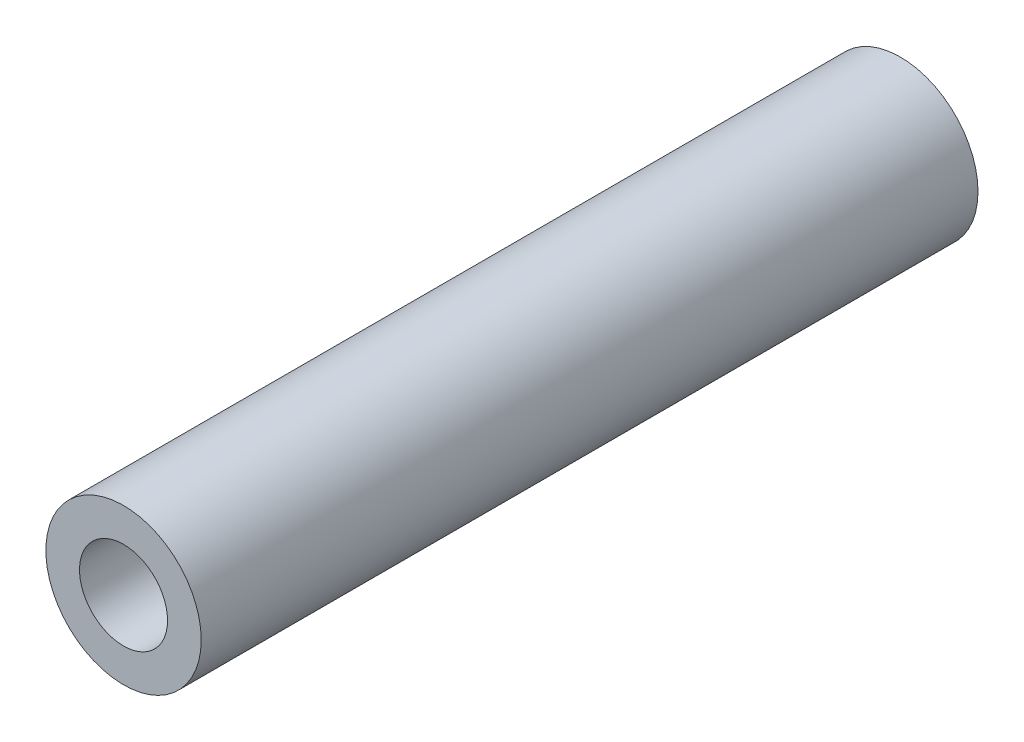
ISO-10303-21;
HEADER;
FILE_DESCRIPTION(('STEP AP214'),'2;1');
FILE_NAME('part.step','',(''),(''),'','','');
FILE_SCHEMA(('AUTOMOTIVE_DESIGN { 1 0 10303 214 1 1 1 1 }'));
ENDSEC;
DATA;
#1=APPLICATION_CONTEXT('core data for automotive mechanical design processes');
#2=APPLICATION_PROTOCOL_DEFINITION('international standard','automotive_design',2000,#1);
#3=PRODUCT_CONTEXT('',#1,'mechanical');
#4=PRODUCT('Part','Part','',(#3));
#5=PRODUCT_RELATED_PRODUCT_CATEGORY('part','',(#4));
#6=PRODUCT_DEFINITION_FORMATION('','',#4);
#7=PRODUCT_DEFINITION_CONTEXT('part definition',#1,'design');
#8=PRODUCT_DEFINITION('design','',#6,#7);
#9=PRODUCT_DEFINITION_SHAPE('','',#8);
#10=(LENGTH_UNIT() NAMED_UNIT(*) SI_UNIT(.MILLI.,.METRE.));
#11=(NAMED_UNIT(*) PLANE_ANGLE_UNIT() SI_UNIT($,.RADIAN.));
#12=(NAMED_UNIT(*) SI_UNIT($,.STERADIAN.) SOLID_ANGLE_UNIT());
#13=UNCERTAINTY_MEASURE_WITH_UNIT(LENGTH_MEASURE(1.E-05),#10,'distance_accuracy_value','');
#14=(GEOMETRIC_REPRESENTATION_CONTEXT(3) GLOBAL_UNCERTAINTY_ASSIGNED_CONTEXT((#13)) GLOBAL_UNIT_ASSIGNED_CONTEXT((#10,
#11,#12)) REPRESENTATION_CONTEXT('',''));
#15=CARTESIAN_POINT('',(0.,0.,0.));
#16=DIRECTION('',(0.,0.,1.));
#17=DIRECTION('',(1.,0.,0.));
#18=AXIS2_PLACEMENT_3D('',#15,#16,#17);
#19=CARTESIAN_POINT('',(21.999999999999,122.799999779877,-14.9999999880791));
#20=DIRECTION('',(0.,0.,1.));
#21=DIRECTION('',(0.,-1.,0.));
#22=AXIS2_PLACEMENT_3D('',#19,#20,#21);
#23=PLANE('',#22);
#24=CARTESIAN_POINT('',(52.9999999999561,148.100000000003,-14.9999999880791));
#25=DIRECTION('',(0.,0.,1.));
#26=DIRECTION('',(-1.,0.,0.));
#27=AXIS2_PLACEMENT_3D('',#24,#25,#26);
#28=CIRCLE('',#27,1.7);
#29=CARTESIAN_POINT('',(54.6999999999561,148.100000000003,-14.9999999880791));
#30=VERTEX_POINT('',#29);
#31=EDGE_CURVE('E57',#30,#30,#28,.T.);
#32=ORIENTED_EDGE('',*,*,#31,.T.);
#33=EDGE_LOOP('',(#32));
#34=FACE_BOUND('',#33,.T.);
#35=CARTESIAN_POINT('',(52.9999999999561,148.100000000003,-14.9999999880791));
#36=DIRECTION('',(0.,0.,1.));
#37=DIRECTION('',(-1.,0.,0.));
#38=AXIS2_PLACEMENT_3D('',#35,#36,#37);
#39=CIRCLE('',#38,3.);
#40=CARTESIAN_POINT('',(55.999999999956,148.100000000003,-14.9999999880791));
#41=VERTEX_POINT('',#40);
#42=EDGE_CURVE('E11',#41,#41,#39,.T.);
#43=ORIENTED_EDGE('',*,*,#42,.F.);
#44=EDGE_LOOP('',(#43));
#45=FACE_BOUND('',#44,.T.);
#46=ADVANCED_FACE('F17',(#34,#45),#23,.F.);
#47=CARTESIAN_POINT('',(21.999999999999,122.799999779877,14.9999999523163));
#48=DIRECTION('',(0.,0.,1.));
#49=DIRECTION('',(0.,-1.,0.));
#50=AXIS2_PLACEMENT_3D('',#47,#48,#49);
#51=PLANE('',#50);
#52=CARTESIAN_POINT('',(52.9999999999561,148.100000000003,14.9999999523163));
#53=DIRECTION('',(0.,0.,-1.));
#54=DIRECTION('',(-1.,0.,0.));
#55=AXIS2_PLACEMENT_3D('',#52,#53,#54);
#56=CIRCLE('',#55,1.7);
#57=CARTESIAN_POINT('',(54.6999999999561,148.100000000003,14.9999999523163));
#58=VERTEX_POINT('',#57);
#59=EDGE_CURVE('E56',#58,#58,#56,.T.);
#60=ORIENTED_EDGE('',*,*,#59,.T.);
#61=EDGE_LOOP('',(#60));
#62=FACE_BOUND('',#61,.T.);
#63=CARTESIAN_POINT('',(52.9999999999561,148.100000000003,14.9999999523163));
#64=DIRECTION('',(0.,0.,1.));
#65=DIRECTION('',(-1.,0.,0.));
#66=AXIS2_PLACEMENT_3D('',#63,#64,#65);
#67=CIRCLE('',#66,3.);
#68=CARTESIAN_POINT('',(55.999999999956,148.100000000003,14.9999999523163));
#69=VERTEX_POINT('',#68);
#70=EDGE_CURVE('E70',#69,#69,#67,.T.);
#71=ORIENTED_EDGE('',*,*,#70,.T.);
#72=EDGE_LOOP('',(#71));
#73=FACE_BOUND('',#72,.T.);
#74=ADVANCED_FACE('F60',(#62,#73),#51,.T.);
#75=CARTESIAN_POINT('',(52.9999999999561,148.100000000003,-14.9999999880791));
#76=DIRECTION('',(0.,0.,1.));
#77=DIRECTION('',(-1.,0.,0.));
#78=AXIS2_PLACEMENT_3D('',#75,#76,#77);
#79=CYLINDRICAL_SURFACE('',#78,3.);
#80=ORIENTED_EDGE('',*,*,#70,.F.);
#81=DIRECTION('',(0.,0.,-1.));
#82=VECTOR('',#81,1.);
#83=CARTESIAN_POINT('',(55.999999999956,148.100000000003,-14.9999999880791));
#84=LINE('',#83,#82);
#85=EDGE_CURVE('E25',#69,#41,#84,.T.);
#86=ORIENTED_EDGE('',*,*,#85,.T.);
#87=ORIENTED_EDGE('',*,*,#42,.T.);
#88=ORIENTED_EDGE('',*,*,#85,.F.);
#89=EDGE_LOOP('',(#80,#86,#87,#88));
#90=FACE_BOUND('',#89,.T.);
#91=ADVANCED_FACE('F81',(#90),#79,.T.);
#92=CARTESIAN_POINT('',(52.9999999999561,148.100000000003,-14.9999999880791));
#93=DIRECTION('',(0.,0.,1.));
#94=DIRECTION('',(-1.,0.,0.));
#95=AXIS2_PLACEMENT_3D('',#92,#93,#94);
#96=CYLINDRICAL_SURFACE('',#95,1.7);
#97=ORIENTED_EDGE('',*,*,#59,.F.);
#98=DIRECTION('',(0.,0.,-1.));
#99=VECTOR('',#98,1.);
#100=CARTESIAN_POINT('',(54.6999999999561,148.100000000003,-14.9999999880791));
#101=LINE('',#100,#99);
#102=EDGE_CURVE('E53',#58,#30,#101,.T.);
#103=ORIENTED_EDGE('',*,*,#102,.T.);
#104=ORIENTED_EDGE('',*,*,#31,.F.);
#105=ORIENTED_EDGE('',*,*,#102,.F.);
#106=EDGE_LOOP('',(#97,#103,#104,#105));
#107=FACE_BOUND('',#106,.T.);
#108=ADVANCED_FACE('F55',(#107),#96,.F.);
#109=CLOSED_SHELL('',(#46,#74,#91,#108));
#110=MANIFOLD_SOLID_BREP('B1',#109);
#111=ADVANCED_BREP_SHAPE_REPRESENTATION('',(#18,#110),#14);
#112=SHAPE_DEFINITION_REPRESENTATION(#9,#111);
ENDSEC;
END-ISO-10303-21;
